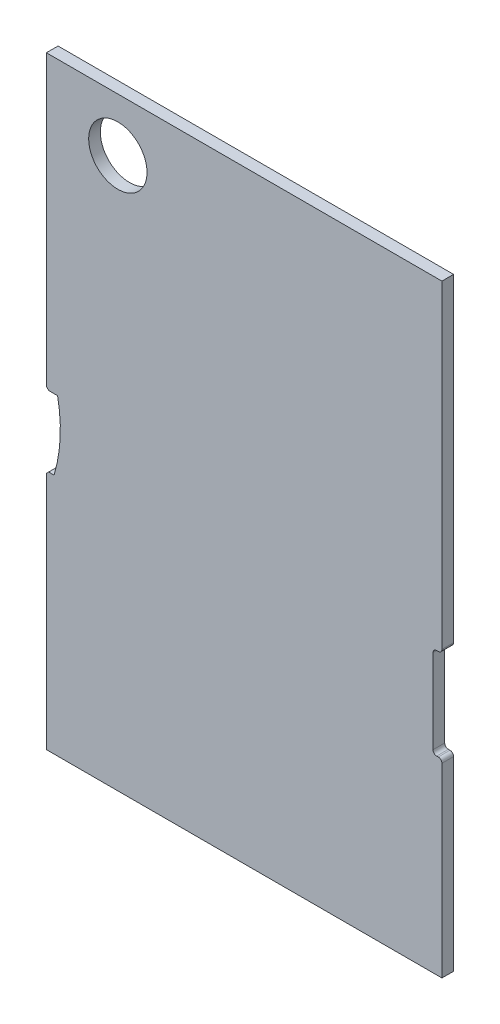
ISO-10303-21;
HEADER;
FILE_DESCRIPTION(('STEP AP214'),'2;1');
FILE_NAME('part.step','',(''),(''),'','','');
FILE_SCHEMA(('AUTOMOTIVE_DESIGN { 1 0 10303 214 1 1 1 1 }'));
ENDSEC;
DATA;
#1=APPLICATION_CONTEXT('core data for automotive mechanical design processes');
#2=APPLICATION_PROTOCOL_DEFINITION('international standard','automotive_design',2000,#1);
#3=PRODUCT_CONTEXT('',#1,'mechanical');
#4=PRODUCT('Part','Part','',(#3));
#5=PRODUCT_RELATED_PRODUCT_CATEGORY('part','',(#4));
#6=PRODUCT_DEFINITION_FORMATION('','',#4);
#7=PRODUCT_DEFINITION_CONTEXT('part definition',#1,'design');
#8=PRODUCT_DEFINITION('design','',#6,#7);
#9=PRODUCT_DEFINITION_SHAPE('','',#8);
#10=(LENGTH_UNIT() NAMED_UNIT(*) SI_UNIT(.MILLI.,.METRE.));
#11=(NAMED_UNIT(*) PLANE_ANGLE_UNIT() SI_UNIT($,.RADIAN.));
#12=(NAMED_UNIT(*) SI_UNIT($,.STERADIAN.) SOLID_ANGLE_UNIT());
#13=UNCERTAINTY_MEASURE_WITH_UNIT(LENGTH_MEASURE(1.E-05),#10,'distance_accuracy_value','');
#14=(GEOMETRIC_REPRESENTATION_CONTEXT(3) GLOBAL_UNCERTAINTY_ASSIGNED_CONTEXT((#13)) GLOBAL_UNIT_ASSIGNED_CONTEXT((#10,
#11,#12)) REPRESENTATION_CONTEXT('',''));
#15=CARTESIAN_POINT('',(0.,0.,0.));
#16=DIRECTION('',(0.,0.,1.));
#17=DIRECTION('',(1.,0.,0.));
#18=AXIS2_PLACEMENT_3D('',#15,#16,#17);
#19=CARTESIAN_POINT('',(153.69999994,125.9799995,-1.6));
#20=DIRECTION('',(0.,1.,0.));
#21=DIRECTION('',(0.,0.,1.));
#22=AXIS2_PLACEMENT_3D('',#19,#20,#21);
#23=PLANE('',#22);
#24=DIRECTION('',(1.,0.,0.));
#25=VECTOR('',#24,1.);
#26=CARTESIAN_POINT('',(153.69999994,125.9799995,-1.6));
#27=LINE('',#26,#25);
#28=CARTESIAN_POINT('',(153.69999994,125.9799995,-1.6));
#29=VERTEX_POINT('',#28);
#30=CARTESIAN_POINT('',(153.48000038,125.9799995,-1.6));
#31=VERTEX_POINT('',#30);
#32=EDGE_CURVE('E147',#29,#31,#27,.F.);
#33=ORIENTED_EDGE('',*,*,#32,.T.);
#34=DIRECTION('',(0.,0.,1.));
#35=VECTOR('',#34,1.);
#36=CARTESIAN_POINT('',(153.48000038,125.9799995,-1.6));
#37=LINE('',#36,#35);
#38=CARTESIAN_POINT('',(153.48000038,125.9799995,0.));
#39=VERTEX_POINT('',#38);
#40=EDGE_CURVE('E297',#31,#39,#37,.T.);
#41=ORIENTED_EDGE('',*,*,#40,.T.);
#42=DIRECTION('',(1.,0.,0.));
#43=VECTOR('',#42,1.);
#44=CARTESIAN_POINT('',(153.69999994,125.9799995,0.));
#45=LINE('',#44,#43);
#46=CARTESIAN_POINT('',(153.69999994,125.9799995,0.));
#47=VERTEX_POINT('',#46);
#48=EDGE_CURVE('E313',#39,#47,#45,.T.);
#49=ORIENTED_EDGE('',*,*,#48,.T.);
#50=DIRECTION('',(0.,0.,1.));
#51=VECTOR('',#50,1.);
#52=CARTESIAN_POINT('',(153.69999994,125.9799995,-1.6));
#53=LINE('',#52,#51);
#54=EDGE_CURVE('E151',#29,#47,#53,.T.);
#55=ORIENTED_EDGE('',*,*,#54,.F.);
#56=EDGE_LOOP('',(#33,#41,#49,#55));
#57=FACE_BOUND('',#56,.T.);
#58=ADVANCED_FACE('F17',(#57),#23,.T.);
#59=CARTESIAN_POINT('',(153.48000038,138.49999986,-1.6));
#60=DIRECTION('',(0.,-1.,0.));
#61=DIRECTION('',(0.,0.,-1.));
#62=AXIS2_PLACEMENT_3D('',#59,#60,#61);
#63=PLANE('',#62);
#64=DIRECTION('',(1.,0.,0.));
#65=VECTOR('',#64,1.);
#66=CARTESIAN_POINT('',(153.48000038,138.49999986,-1.6));
#67=LINE('',#66,#65);
#68=CARTESIAN_POINT('',(153.48000038,138.49999986,-1.6));
#69=VERTEX_POINT('',#68);
#70=CARTESIAN_POINT('',(153.69999994,138.49999986,-1.6));
#71=VERTEX_POINT('',#70);
#72=EDGE_CURVE('E152',#69,#71,#67,.T.);
#73=ORIENTED_EDGE('',*,*,#72,.T.);
#74=DIRECTION('',(0.,0.,1.));
#75=VECTOR('',#74,1.);
#76=CARTESIAN_POINT('',(153.69999994,138.49999986,-1.6));
#77=LINE('',#76,#75);
#78=CARTESIAN_POINT('',(153.69999994,138.49999986,0.));
#79=VERTEX_POINT('',#78);
#80=EDGE_CURVE('E290',#79,#71,#77,.F.);
#81=ORIENTED_EDGE('',*,*,#80,.F.);
#82=DIRECTION('',(1.,0.,0.));
#83=VECTOR('',#82,1.);
#84=CARTESIAN_POINT('',(153.48000038,138.49999986,0.));
#85=LINE('',#84,#83);
#86=CARTESIAN_POINT('',(153.48000038,138.49999986,0.));
#87=VERTEX_POINT('',#86);
#88=EDGE_CURVE('E310',#79,#87,#85,.F.);
#89=ORIENTED_EDGE('',*,*,#88,.T.);
#90=DIRECTION('',(0.,0.,1.));
#91=VECTOR('',#90,1.);
#92=CARTESIAN_POINT('',(153.48000038,138.49999986,-1.6));
#93=LINE('',#92,#91);
#94=EDGE_CURVE('E294',#87,#69,#93,.F.);
#95=ORIENTED_EDGE('',*,*,#94,.T.);
#96=EDGE_LOOP('',(#73,#81,#89,#95));
#97=FACE_BOUND('',#96,.T.);
#98=ADVANCED_FACE('F348',(#97),#63,.T.);
#99=CARTESIAN_POINT('',(153.69999994,125.4800005,-1.6));
#100=DIRECTION('',(0.,0.,1.));
#101=DIRECTION('',(1.,0.,0.));
#102=AXIS2_PLACEMENT_3D('',#99,#100,#101);
#103=CYLINDRICAL_SURFACE('',#102,0.499999000000001);
#104=CARTESIAN_POINT('',(153.69999994,125.4800005,-1.6));
#105=DIRECTION('',(0.,0.,1.));
#106=DIRECTION('',(1.,0.,0.));
#107=AXIS2_PLACEMENT_3D('',#104,#105,#106);
#108=CIRCLE('',#107,0.499999000000001);
#109=CARTESIAN_POINT('',(154.19999894,125.4800005,-1.6));
#110=VERTEX_POINT('',#109);
#111=EDGE_CURVE('E20',#110,#29,#108,.T.);
#112=ORIENTED_EDGE('',*,*,#111,.T.);
#113=ORIENTED_EDGE('',*,*,#54,.T.);
#114=CARTESIAN_POINT('',(153.69999994,125.4800005,0.));
#115=DIRECTION('',(0.,0.,1.));
#116=DIRECTION('',(1.,0.,0.));
#117=AXIS2_PLACEMENT_3D('',#114,#115,#116);
#118=CIRCLE('',#117,0.499999000000001);
#119=CARTESIAN_POINT('',(154.19999894,125.4800005,0.));
#120=VERTEX_POINT('',#119);
#121=EDGE_CURVE('E157',#120,#47,#118,.T.);
#122=ORIENTED_EDGE('',*,*,#121,.F.);
#123=DIRECTION('',(0.,0.,-1.));
#124=VECTOR('',#123,1.);
#125=CARTESIAN_POINT('',(154.19999894,125.4800005,-1.6));
#126=LINE('',#125,#124);
#127=EDGE_CURVE('E154',#110,#120,#126,.F.);
#128=ORIENTED_EDGE('',*,*,#127,.F.);
#129=EDGE_LOOP('',(#112,#113,#122,#128));
#130=FACE_BOUND('',#129,.T.);
#131=ADVANCED_FACE('F155',(#130),#103,.T.);
#132=CARTESIAN_POINT('',(153.48000038,126.4799985,-1.6));
#133=DIRECTION('',(0.,0.,1.));
#134=DIRECTION('',(1.,0.,0.));
#135=AXIS2_PLACEMENT_3D('',#132,#133,#134);
#136=CYLINDRICAL_SURFACE('',#135,0.499998999999973);
#137=ORIENTED_EDGE('',*,*,#40,.F.);
#138=CARTESIAN_POINT('',(153.48000038,126.4799985,-1.6));
#139=DIRECTION('',(0.,0.,1.));
#140=DIRECTION('',(1.,0.,0.));
#141=AXIS2_PLACEMENT_3D('',#138,#139,#140);
#142=CIRCLE('',#141,0.499998999999973);
#143=CARTESIAN_POINT('',(152.98000138,126.4799985,-1.6));
#144=VERTEX_POINT('',#143);
#145=EDGE_CURVE('E300',#144,#31,#142,.T.);
#146=ORIENTED_EDGE('',*,*,#145,.F.);
#147=DIRECTION('',(0.,0.,-1.));
#148=VECTOR('',#147,1.);
#149=CARTESIAN_POINT('',(152.98000138,126.4799985,-1.6));
#150=LINE('',#149,#148);
#151=CARTESIAN_POINT('',(152.98000138,126.4799985,0.));
#152=VERTEX_POINT('',#151);
#153=EDGE_CURVE('E200',#152,#144,#150,.T.);
#154=ORIENTED_EDGE('',*,*,#153,.F.);
#155=CARTESIAN_POINT('',(153.48000038,126.4799985,0.));
#156=DIRECTION('',(0.,0.,1.));
#157=DIRECTION('',(1.,0.,0.));
#158=AXIS2_PLACEMENT_3D('',#155,#156,#157);
#159=CIRCLE('',#158,0.499998999999973);
#160=EDGE_CURVE('E330',#39,#152,#159,.F.);
#161=ORIENTED_EDGE('',*,*,#160,.F.);
#162=EDGE_LOOP('',(#137,#146,#154,#161));
#163=FACE_BOUND('',#162,.T.);
#164=ADVANCED_FACE('F338',(#163),#136,.F.);
#165=CARTESIAN_POINT('',(153.48000038,138.00000086,-1.6));
#166=DIRECTION('',(0.,0.,1.));
#167=DIRECTION('',(1.,0.,0.));
#168=AXIS2_PLACEMENT_3D('',#165,#166,#167);
#169=CYLINDRICAL_SURFACE('',#168,0.499998999999973);
#170=DIRECTION('',(0.,0.,-1.));
#171=VECTOR('',#170,1.);
#172=CARTESIAN_POINT('',(152.98000138,138.00000086,-1.6));
#173=LINE('',#172,#171);
#174=CARTESIAN_POINT('',(152.98000138,138.00000086,-1.6));
#175=VERTEX_POINT('',#174);
#176=CARTESIAN_POINT('',(152.98000138,138.00000086,0.));
#177=VERTEX_POINT('',#176);
#178=EDGE_CURVE('E203',#175,#177,#173,.F.);
#179=ORIENTED_EDGE('',*,*,#178,.F.);
#180=CARTESIAN_POINT('',(153.48000038,138.00000086,-1.6));
#181=DIRECTION('',(0.,0.,1.));
#182=DIRECTION('',(1.,0.,0.));
#183=AXIS2_PLACEMENT_3D('',#180,#181,#182);
#184=CIRCLE('',#183,0.499998999999973);
#185=EDGE_CURVE('E293',#69,#175,#184,.T.);
#186=ORIENTED_EDGE('',*,*,#185,.F.);
#187=ORIENTED_EDGE('',*,*,#94,.F.);
#188=CARTESIAN_POINT('',(153.48000038,138.00000086,0.));
#189=DIRECTION('',(0.,0.,1.));
#190=DIRECTION('',(1.,0.,0.));
#191=AXIS2_PLACEMENT_3D('',#188,#189,#190);
#192=CIRCLE('',#191,0.499998999999973);
#193=EDGE_CURVE('E327',#177,#87,#192,.F.);
#194=ORIENTED_EDGE('',*,*,#193,.F.);
#195=EDGE_LOOP('',(#179,#186,#187,#194));
#196=FACE_BOUND('',#195,.T.);
#197=ADVANCED_FACE('F414',(#196),#169,.F.);
#198=CARTESIAN_POINT('',(153.69999994,138.99999886,-1.6));
#199=DIRECTION('',(0.,0.,1.));
#200=DIRECTION('',(1.,0.,0.));
#201=AXIS2_PLACEMENT_3D('',#198,#199,#200);
#202=CYLINDRICAL_SURFACE('',#201,0.499999000000001);
#203=CARTESIAN_POINT('',(153.69999994,138.99999886,-1.6));
#204=DIRECTION('',(0.,0.,1.));
#205=DIRECTION('',(1.,0.,0.));
#206=AXIS2_PLACEMENT_3D('',#203,#204,#205);
#207=CIRCLE('',#206,0.499999000000001);
#208=CARTESIAN_POINT('',(154.19999894,138.99999886,-1.6));
#209=VERTEX_POINT('',#208);
#210=EDGE_CURVE('E257',#71,#209,#207,.T.);
#211=ORIENTED_EDGE('',*,*,#210,.T.);
#212=DIRECTION('',(0.,0.,-1.));
#213=VECTOR('',#212,1.);
#214=CARTESIAN_POINT('',(154.19999894,138.99999886,-1.6));
#215=LINE('',#214,#213);
#216=CARTESIAN_POINT('',(154.19999894,138.99999886,0.));
#217=VERTEX_POINT('',#216);
#218=EDGE_CURVE('E184',#217,#209,#215,.T.);
#219=ORIENTED_EDGE('',*,*,#218,.F.);
#220=CARTESIAN_POINT('',(153.69999994,138.99999886,0.));
#221=DIRECTION('',(0.,0.,1.));
#222=DIRECTION('',(1.,0.,0.));
#223=AXIS2_PLACEMENT_3D('',#220,#221,#222);
#224=CIRCLE('',#223,0.499999000000001);
#225=EDGE_CURVE('E261',#79,#217,#224,.T.);
#226=ORIENTED_EDGE('',*,*,#225,.F.);
#227=ORIENTED_EDGE('',*,*,#80,.T.);
#228=EDGE_LOOP('',(#211,#219,#226,#227));
#229=FACE_BOUND('',#228,.T.);
#230=ADVANCED_FACE('F410',(#229),#202,.T.);
#231=CARTESIAN_POINT('',(100.00000066,143.09000084,-1.6));
#232=DIRECTION('',(-0.707106781186548,-0.707106781186548,0.));
#233=DIRECTION('',(0.707106781186548,-0.707106781186548,0.));
#234=AXIS2_PLACEMENT_3D('',#231,#232,#233);
#235=PLANE('',#234);
#236=DIRECTION('',(0.707106781186548,-0.707106781186548,0.));
#237=VECTOR('',#236,1.);
#238=CARTESIAN_POINT('',(100.00000066,143.09000084,-1.6));
#239=LINE('',#238,#237);
#240=CARTESIAN_POINT('',(100.00000066,143.09000084,-1.6));
#241=VERTEX_POINT('',#240);
#242=CARTESIAN_POINT('',(100.32108714,142.76891436,-1.6));
#243=VERTEX_POINT('',#242);
#244=EDGE_CURVE('E248',#241,#243,#239,.T.);
#245=ORIENTED_EDGE('',*,*,#244,.T.);
#246=DIRECTION('',(0.,0.,-1.));
#247=VECTOR('',#246,1.);
#248=CARTESIAN_POINT('',(100.32108714,142.76891436,-1.6));
#249=LINE('',#248,#247);
#250=CARTESIAN_POINT('',(100.32108714,142.76891436,0.));
#251=VERTEX_POINT('',#250);
#252=EDGE_CURVE('E177',#251,#243,#249,.T.);
#253=ORIENTED_EDGE('',*,*,#252,.F.);
#254=DIRECTION('',(0.707106781186532,-0.707106781186563,0.));
#255=VECTOR('',#254,1.);
#256=CARTESIAN_POINT('',(100.00000066,143.09000084,0.));
#257=LINE('',#256,#255);
#258=CARTESIAN_POINT('',(100.00000066,143.09000084,0.));
#259=VERTEX_POINT('',#258);
#260=EDGE_CURVE('E226',#259,#251,#257,.T.);
#261=ORIENTED_EDGE('',*,*,#260,.F.);
#262=DIRECTION('',(0.,0.,1.));
#263=VECTOR('',#262,1.);
#264=CARTESIAN_POINT('',(100.00000066,143.09000084,-1.6));
#265=LINE('',#264,#263);
#266=EDGE_CURVE('E253',#241,#259,#265,.T.);
#267=ORIENTED_EDGE('',*,*,#266,.F.);
#268=EDGE_LOOP('',(#245,#253,#261,#267));
#269=FACE_BOUND('',#268,.T.);
#270=ADVANCED_FACE('F406',(#269),#235,.T.);
#271=CARTESIAN_POINT('',(101.04820024,133.1000005,-1.6));
#272=DIRECTION('',(0.,1.,0.));
#273=DIRECTION('',(0.,0.,1.));
#274=AXIS2_PLACEMENT_3D('',#271,#272,#273);
#275=PLANE('',#274);
#276=DIRECTION('',(1.,0.,0.));
#277=VECTOR('',#276,1.);
#278=CARTESIAN_POINT('',(101.04820024,133.1000005,-1.6));
#279=LINE('',#278,#277);
#280=CARTESIAN_POINT('',(101.048201527625,133.1000005,-1.6));
#281=VERTEX_POINT('',#280);
#282=CARTESIAN_POINT('',(100.31000004,133.1000005,-1.6));
#283=VERTEX_POINT('',#282);
#284=EDGE_CURVE('E245',#281,#283,#279,.F.);
#285=ORIENTED_EDGE('',*,*,#284,.T.);
#286=DIRECTION('',(0.,0.,1.));
#287=VECTOR('',#286,1.);
#288=CARTESIAN_POINT('',(100.31000004,133.1000005,-1.6));
#289=LINE('',#288,#287);
#290=CARTESIAN_POINT('',(100.31000004,133.1000005,0.));
#291=VERTEX_POINT('',#290);
#292=EDGE_CURVE('E247',#291,#283,#289,.F.);
#293=ORIENTED_EDGE('',*,*,#292,.F.);
#294=DIRECTION('',(1.,0.,0.));
#295=VECTOR('',#294,1.);
#296=CARTESIAN_POINT('',(153.69999994,133.1000005,0.));
#297=LINE('',#296,#295);
#298=CARTESIAN_POINT('',(101.048201527625,133.1000005,0.));
#299=VERTEX_POINT('',#298);
#300=EDGE_CURVE('E223',#299,#291,#297,.F.);
#301=ORIENTED_EDGE('',*,*,#300,.F.);
#302=DIRECTION('',(0.,0.,1.));
#303=VECTOR('',#302,1.);
#304=CARTESIAN_POINT('',(101.048201527625,133.1000005,0.));
#305=LINE('',#304,#303);
#306=EDGE_CURVE('E236',#299,#281,#305,.F.);
#307=ORIENTED_EDGE('',*,*,#306,.T.);
#308=EDGE_LOOP('',(#285,#293,#301,#307));
#309=FACE_BOUND('',#308,.T.);
#310=ADVANCED_FACE('F403',(#309),#275,.T.);
#311=CARTESIAN_POINT('',(100.31000004,133.1000005,-1.6));
#312=DIRECTION('',(-0.707106781186516,0.707106781186579,0.));
#313=DIRECTION('',(-0.707106781186579,-0.707106781186516,0.));
#314=AXIS2_PLACEMENT_3D('',#311,#312,#313);
#315=PLANE('',#314);
#316=DIRECTION('',(-0.707106781186579,-0.707106781186516,0.));
#317=VECTOR('',#316,1.);
#318=CARTESIAN_POINT('',(100.31000004,133.1000005,-1.6));
#319=LINE('',#318,#317);
#320=CARTESIAN_POINT('',(100.00000066,132.79000112,-1.6));
#321=VERTEX_POINT('',#320);
#322=EDGE_CURVE('E35',#283,#321,#319,.T.);
#323=ORIENTED_EDGE('',*,*,#322,.T.);
#324=DIRECTION('',(0.,0.,1.));
#325=VECTOR('',#324,1.);
#326=CARTESIAN_POINT('',(100.00000066,132.79000112,-1.6));
#327=LINE('',#326,#325);
#328=CARTESIAN_POINT('',(100.00000066,132.79000112,0.));
#329=VERTEX_POINT('',#328);
#330=EDGE_CURVE('E215',#329,#321,#327,.F.);
#331=ORIENTED_EDGE('',*,*,#330,.F.);
#332=DIRECTION('',(-0.707106781186579,-0.707106781186516,0.));
#333=VECTOR('',#332,1.);
#334=CARTESIAN_POINT('',(100.31000004,133.1000005,0.));
#335=LINE('',#334,#333);
#336=EDGE_CURVE('E225',#291,#329,#335,.T.);
#337=ORIENTED_EDGE('',*,*,#336,.F.);
#338=ORIENTED_EDGE('',*,*,#292,.T.);
#339=EDGE_LOOP('',(#323,#331,#337,#338));
#340=FACE_BOUND('',#339,.T.);
#341=ADVANCED_FACE('F399',(#340),#315,.T.);
#342=CARTESIAN_POINT('',(153.69999994,125.4800005,0.));
#343=DIRECTION('',(0.,0.,1.));
#344=DIRECTION('',(1.,0.,0.));
#345=AXIS2_PLACEMENT_3D('',#342,#343,#344);
#346=PLANE('',#345);
#347=CARTESIAN_POINT('',(109.78999886,175.38999974,0.));
#348=DIRECTION('',(0.,0.,-1.));
#349=DIRECTION('',(-1.,0.,0.));
#350=AXIS2_PLACEMENT_3D('',#347,#348,#349);
#351=CIRCLE('',#350,3.99999962);
#352=CARTESIAN_POINT('',(105.78999924,175.38999974,0.));
#353=VERTEX_POINT('',#352);
#354=EDGE_CURVE('E171',#353,#353,#351,.T.);
#355=ORIENTED_EDGE('',*,*,#354,.T.);
#356=EDGE_LOOP('',(#355));
#357=FACE_BOUND('',#356,.T.);
#358=ORIENTED_EDGE('',*,*,#300,.T.);
#359=ORIENTED_EDGE('',*,*,#336,.T.);
#360=DIRECTION('',(0.,1.,0.));
#361=VECTOR('',#360,1.);
#362=CARTESIAN_POINT('',(100.00000066,132.79000112,0.));
#363=LINE('',#362,#361);
#364=CARTESIAN_POINT('',(100.00000066,100.00000066,0.));
#365=VERTEX_POINT('',#364);
#366=EDGE_CURVE('E233',#365,#329,#363,.T.);
#367=ORIENTED_EDGE('',*,*,#366,.F.);
#368=DIRECTION('',(1.,0.,0.));
#369=VECTOR('',#368,1.);
#370=CARTESIAN_POINT('',(100.00000066,100.00000066,0.));
#371=LINE('',#370,#369);
#372=CARTESIAN_POINT('',(154.19999894,100.00000066,0.));
#373=VERTEX_POINT('',#372);
#374=EDGE_CURVE('E229',#373,#365,#371,.F.);
#375=ORIENTED_EDGE('',*,*,#374,.F.);
#376=DIRECTION('',(0.,1.,0.));
#377=VECTOR('',#376,1.);
#378=CARTESIAN_POINT('',(154.19999894,100.00000066,0.));
#379=LINE('',#378,#377);
#380=EDGE_CURVE('E207',#120,#373,#379,.F.);
#381=ORIENTED_EDGE('',*,*,#380,.F.);
#382=ORIENTED_EDGE('',*,*,#121,.T.);
#383=ORIENTED_EDGE('',*,*,#48,.F.);
#384=ORIENTED_EDGE('',*,*,#160,.T.);
#385=DIRECTION('',(0.,1.,0.));
#386=VECTOR('',#385,1.);
#387=CARTESIAN_POINT('',(152.98000138,126.4799985,0.));
#388=LINE('',#387,#386);
#389=EDGE_CURVE('E160',#177,#152,#388,.F.);
#390=ORIENTED_EDGE('',*,*,#389,.F.);
#391=ORIENTED_EDGE('',*,*,#193,.T.);
#392=ORIENTED_EDGE('',*,*,#88,.F.);
#393=ORIENTED_EDGE('',*,*,#225,.T.);
#394=DIRECTION('',(0.,1.,0.));
#395=VECTOR('',#394,1.);
#396=CARTESIAN_POINT('',(154.19999894,138.99999886,0.));
#397=LINE('',#396,#395);
#398=CARTESIAN_POINT('',(154.19999894,182.70000036,0.));
#399=VERTEX_POINT('',#398);
#400=EDGE_CURVE('E188',#399,#217,#397,.F.);
#401=ORIENTED_EDGE('',*,*,#400,.F.);
#402=DIRECTION('',(1.,0.,0.));
#403=VECTOR('',#402,1.);
#404=CARTESIAN_POINT('',(154.19999894,182.70000036,0.));
#405=LINE('',#404,#403);
#406=CARTESIAN_POINT('',(100.00000066,182.70000036,0.));
#407=VERTEX_POINT('',#406);
#408=EDGE_CURVE('E187',#407,#399,#405,.T.);
#409=ORIENTED_EDGE('',*,*,#408,.F.);
#410=DIRECTION('',(0.,1.,0.));
#411=VECTOR('',#410,1.);
#412=CARTESIAN_POINT('',(100.00000066,182.70000036,0.));
#413=LINE('',#412,#411);
#414=EDGE_CURVE('E197',#259,#407,#413,.T.);
#415=ORIENTED_EDGE('',*,*,#414,.F.);
#416=ORIENTED_EDGE('',*,*,#260,.T.);
#417=DIRECTION('',(1.,0.,0.));
#418=VECTOR('',#417,1.);
#419=CARTESIAN_POINT('',(100.32108714,142.76891436,0.));
#420=LINE('',#419,#418);
#421=CARTESIAN_POINT('',(101.534055277497,142.76891436,0.));
#422=VERTEX_POINT('',#421);
#423=EDGE_CURVE('E181',#422,#251,#420,.F.);
#424=ORIENTED_EDGE('',*,*,#423,.F.);
#425=CARTESIAN_POINT('',(81.96409312,138.90562262,0.));
#426=DIRECTION('',(0.,0.,1.));
#427=DIRECTION('',(1.,0.,0.));
#428=AXIS2_PLACEMENT_3D('',#425,#426,#427);
#429=CIRCLE('',#428,19.9476425152004);
#430=EDGE_CURVE('E321',#422,#299,#429,.F.);
#431=ORIENTED_EDGE('',*,*,#430,.T.);
#432=EDGE_LOOP('',(#358,#359,#367,#375,#381,#382,#383,#384,#390,#391,#392,#393,#401,#409,#415,
#416,#424,#431));
#433=FACE_BOUND('',#432,.T.);
#434=ADVANCED_FACE('F345',(#357,#433),#346,.T.);
#435=CARTESIAN_POINT('',(100.00000066,100.00000066,-1.6));
#436=DIRECTION('',(0.,-1.,0.));
#437=DIRECTION('',(0.,0.,-1.));
#438=AXIS2_PLACEMENT_3D('',#435,#436,#437);
#439=PLANE('',#438);
#440=DIRECTION('',(1.,0.,0.));
#441=VECTOR('',#440,1.);
#442=CARTESIAN_POINT('',(153.69999994,100.00000066,-1.6));
#443=LINE('',#442,#441);
#444=CARTESIAN_POINT('',(100.00000066,100.00000066,-1.6));
#445=VERTEX_POINT('',#444);
#446=CARTESIAN_POINT('',(154.19999894,100.00000066,-1.6));
#447=VERTEX_POINT('',#446);
#448=EDGE_CURVE('E166',#445,#447,#443,.T.);
#449=ORIENTED_EDGE('',*,*,#448,.T.);
#450=DIRECTION('',(0.,0.,-1.));
#451=VECTOR('',#450,1.);
#452=CARTESIAN_POINT('',(154.19999894,100.00000066,-1.6));
#453=LINE('',#452,#451);
#454=EDGE_CURVE('E161',#373,#447,#453,.T.);
#455=ORIENTED_EDGE('',*,*,#454,.F.);
#456=ORIENTED_EDGE('',*,*,#374,.T.);
#457=DIRECTION('',(0.,0.,1.));
#458=VECTOR('',#457,1.);
#459=CARTESIAN_POINT('',(100.00000066,100.00000066,-1.6));
#460=LINE('',#459,#458);
#461=EDGE_CURVE('E212',#445,#365,#460,.T.);
#462=ORIENTED_EDGE('',*,*,#461,.F.);
#463=EDGE_LOOP('',(#449,#455,#456,#462));
#464=FACE_BOUND('',#463,.T.);
#465=ADVANCED_FACE('F393',(#464),#439,.T.);
#466=CARTESIAN_POINT('',(154.19999894,100.00000066,-1.6));
#467=DIRECTION('',(1.,0.,0.));
#468=DIRECTION('',(0.,0.,-1.));
#469=AXIS2_PLACEMENT_3D('',#466,#467,#468);
#470=PLANE('',#469);
#471=DIRECTION('',(0.,1.,0.));
#472=VECTOR('',#471,1.);
#473=CARTESIAN_POINT('',(154.19999894,125.4800005,-1.6));
#474=LINE('',#473,#472);
#475=EDGE_CURVE('E144',#447,#110,#474,.T.);
#476=ORIENTED_EDGE('',*,*,#475,.T.);
#477=ORIENTED_EDGE('',*,*,#127,.T.);
#478=ORIENTED_EDGE('',*,*,#380,.T.);
#479=ORIENTED_EDGE('',*,*,#454,.T.);
#480=EDGE_LOOP('',(#476,#477,#478,#479));
#481=FACE_BOUND('',#480,.T.);
#482=ADVANCED_FACE('F163',(#481),#470,.T.);
#483=CARTESIAN_POINT('',(152.98000138,126.4799985,-1.6));
#484=DIRECTION('',(1.,0.,0.));
#485=DIRECTION('',(0.,0.,-1.));
#486=AXIS2_PLACEMENT_3D('',#483,#484,#485);
#487=PLANE('',#486);
#488=DIRECTION('',(0.,1.,0.));
#489=VECTOR('',#488,1.);
#490=CARTESIAN_POINT('',(152.98000138,125.4800005,-1.6));
#491=LINE('',#490,#489);
#492=EDGE_CURVE('E165',#144,#175,#491,.T.);
#493=ORIENTED_EDGE('',*,*,#492,.T.);
#494=ORIENTED_EDGE('',*,*,#178,.T.);
#495=ORIENTED_EDGE('',*,*,#389,.T.);
#496=ORIENTED_EDGE('',*,*,#153,.T.);
#497=EDGE_LOOP('',(#493,#494,#495,#496));
#498=FACE_BOUND('',#497,.T.);
#499=ADVANCED_FACE('F341',(#498),#487,.T.);
#500=CARTESIAN_POINT('',(154.19999894,138.99999886,-1.6));
#501=DIRECTION('',(1.,0.,0.));
#502=DIRECTION('',(0.,0.,-1.));
#503=AXIS2_PLACEMENT_3D('',#500,#501,#502);
#504=PLANE('',#503);
#505=DIRECTION('',(0.,1.,0.));
#506=VECTOR('',#505,1.);
#507=CARTESIAN_POINT('',(154.19999894,125.4800005,-1.6));
#508=LINE('',#507,#506);
#509=CARTESIAN_POINT('',(154.19999894,182.70000036,-1.6));
#510=VERTEX_POINT('',#509);
#511=EDGE_CURVE('E169',#209,#510,#508,.T.);
#512=ORIENTED_EDGE('',*,*,#511,.T.);
#513=DIRECTION('',(0.,0.,1.));
#514=VECTOR('',#513,1.);
#515=CARTESIAN_POINT('',(154.19999894,182.70000036,-1.6));
#516=LINE('',#515,#514);
#517=EDGE_CURVE('E195',#399,#510,#516,.F.);
#518=ORIENTED_EDGE('',*,*,#517,.F.);
#519=ORIENTED_EDGE('',*,*,#400,.T.);
#520=ORIENTED_EDGE('',*,*,#218,.T.);
#521=EDGE_LOOP('',(#512,#518,#519,#520));
#522=FACE_BOUND('',#521,.T.);
#523=ADVANCED_FACE('F384',(#522),#504,.T.);
#524=CARTESIAN_POINT('',(154.19999894,182.70000036,-1.6));
#525=DIRECTION('',(0.,1.,0.));
#526=DIRECTION('',(0.,0.,1.));
#527=AXIS2_PLACEMENT_3D('',#524,#525,#526);
#528=PLANE('',#527);
#529=DIRECTION('',(1.,0.,0.));
#530=VECTOR('',#529,1.);
#531=CARTESIAN_POINT('',(153.69999994,182.70000036,-1.6));
#532=LINE('',#531,#530);
#533=CARTESIAN_POINT('',(100.00000066,182.70000036,-1.6));
#534=VERTEX_POINT('',#533);
#535=EDGE_CURVE('E189',#510,#534,#532,.F.);
#536=ORIENTED_EDGE('',*,*,#535,.T.);
#537=DIRECTION('',(0.,0.,1.));
#538=VECTOR('',#537,1.);
#539=CARTESIAN_POINT('',(100.00000066,182.70000036,-1.6));
#540=LINE('',#539,#538);
#541=EDGE_CURVE('E272',#407,#534,#540,.F.);
#542=ORIENTED_EDGE('',*,*,#541,.F.);
#543=ORIENTED_EDGE('',*,*,#408,.T.);
#544=ORIENTED_EDGE('',*,*,#517,.T.);
#545=EDGE_LOOP('',(#536,#542,#543,#544));
#546=FACE_BOUND('',#545,.T.);
#547=ADVANCED_FACE('F380',(#546),#528,.T.);
#548=CARTESIAN_POINT('',(100.00000066,182.70000036,-1.6));
#549=DIRECTION('',(-1.,0.,0.));
#550=DIRECTION('',(0.,0.,1.));
#551=AXIS2_PLACEMENT_3D('',#548,#549,#550);
#552=PLANE('',#551);
#553=DIRECTION('',(0.,1.,0.));
#554=VECTOR('',#553,1.);
#555=CARTESIAN_POINT('',(100.00000066,125.4800005,-1.6));
#556=LINE('',#555,#554);
#557=EDGE_CURVE('E192',#534,#241,#556,.F.);
#558=ORIENTED_EDGE('',*,*,#557,.T.);
#559=ORIENTED_EDGE('',*,*,#266,.T.);
#560=ORIENTED_EDGE('',*,*,#414,.T.);
#561=ORIENTED_EDGE('',*,*,#541,.T.);
#562=EDGE_LOOP('',(#558,#559,#560,#561));
#563=FACE_BOUND('',#562,.T.);
#564=ADVANCED_FACE('F376',(#563),#552,.T.);
#565=CARTESIAN_POINT('',(100.32108714,142.76891436,-1.6));
#566=DIRECTION('',(0.,-1.,0.));
#567=DIRECTION('',(0.,0.,-1.));
#568=AXIS2_PLACEMENT_3D('',#565,#566,#567);
#569=PLANE('',#568);
#570=DIRECTION('',(1.,0.,0.));
#571=VECTOR('',#570,1.);
#572=CARTESIAN_POINT('',(153.69999994,142.76891436,-1.6));
#573=LINE('',#572,#571);
#574=CARTESIAN_POINT('',(101.534055277497,142.76891436,-1.6));
#575=VERTEX_POINT('',#574);
#576=EDGE_CURVE('E307',#243,#575,#573,.T.);
#577=ORIENTED_EDGE('',*,*,#576,.T.);
#578=DIRECTION('',(0.,0.,1.));
#579=VECTOR('',#578,1.);
#580=CARTESIAN_POINT('',(101.534055277497,142.76891436,-1.6));
#581=LINE('',#580,#579);
#582=EDGE_CURVE('E180',#575,#422,#581,.T.);
#583=ORIENTED_EDGE('',*,*,#582,.T.);
#584=ORIENTED_EDGE('',*,*,#423,.T.);
#585=ORIENTED_EDGE('',*,*,#252,.T.);
#586=EDGE_LOOP('',(#577,#583,#584,#585));
#587=FACE_BOUND('',#586,.T.);
#588=ADVANCED_FACE('F372',(#587),#569,.T.);
#589=CARTESIAN_POINT('',(81.96409312,138.90562262,-1.6));
#590=DIRECTION('',(0.,0.,1.));
#591=DIRECTION('',(1.,0.,0.));
#592=AXIS2_PLACEMENT_3D('',#589,#590,#591);
#593=CYLINDRICAL_SURFACE('',#592,19.9476425152004);
#594=CARTESIAN_POINT('',(81.96409312,138.90562262,-1.6));
#595=DIRECTION('',(0.,0.,1.));
#596=DIRECTION('',(1.,0.,0.));
#597=AXIS2_PLACEMENT_3D('',#594,#595,#596);
#598=CIRCLE('',#597,19.9476425152004);
#599=EDGE_CURVE('E220',#575,#281,#598,.F.);
#600=ORIENTED_EDGE('',*,*,#599,.T.);
#601=ORIENTED_EDGE('',*,*,#306,.F.);
#602=ORIENTED_EDGE('',*,*,#430,.F.);
#603=ORIENTED_EDGE('',*,*,#582,.F.);
#604=EDGE_LOOP('',(#600,#601,#602,#603));
#605=FACE_BOUND('',#604,.T.);
#606=ADVANCED_FACE('F368',(#605),#593,.F.);
#607=CARTESIAN_POINT('',(100.00000066,132.79000112,-1.6));
#608=DIRECTION('',(-1.,0.,0.));
#609=DIRECTION('',(0.,0.,1.));
#610=AXIS2_PLACEMENT_3D('',#607,#608,#609);
#611=PLANE('',#610);
#612=DIRECTION('',(0.,1.,0.));
#613=VECTOR('',#612,1.);
#614=CARTESIAN_POINT('',(100.00000066,125.4800005,-1.6));
#615=LINE('',#614,#613);
#616=EDGE_CURVE('E26',#321,#445,#615,.F.);
#617=ORIENTED_EDGE('',*,*,#616,.T.);
#618=ORIENTED_EDGE('',*,*,#461,.T.);
#619=ORIENTED_EDGE('',*,*,#366,.T.);
#620=ORIENTED_EDGE('',*,*,#330,.T.);
#621=EDGE_LOOP('',(#617,#618,#619,#620));
#622=FACE_BOUND('',#621,.T.);
#623=ADVANCED_FACE('F361',(#622),#611,.T.);
#624=CARTESIAN_POINT('',(109.78999886,175.38999974,0.04826));
#625=DIRECTION('',(0.,0.,-1.));
#626=DIRECTION('',(-1.,0.,0.));
#627=AXIS2_PLACEMENT_3D('',#624,#625,#626);
#628=CYLINDRICAL_SURFACE('',#627,3.99999962);
#629=CARTESIAN_POINT('',(109.78999886,175.38999974,-1.6));
#630=DIRECTION('',(0.,0.,-1.));
#631=DIRECTION('',(-1.,0.,0.));
#632=AXIS2_PLACEMENT_3D('',#629,#630,#631);
#633=CIRCLE('',#632,3.99999962);
#634=CARTESIAN_POINT('',(105.78999924,175.38999974,-1.6));
#635=VERTEX_POINT('',#634);
#636=EDGE_CURVE('E11',#635,#635,#633,.T.);
#637=ORIENTED_EDGE('',*,*,#636,.T.);
#638=EDGE_LOOP('',(#637));
#639=FACE_BOUND('',#638,.T.);
#640=ORIENTED_EDGE('',*,*,#354,.F.);
#641=EDGE_LOOP('',(#640));
#642=FACE_BOUND('',#641,.T.);
#643=ADVANCED_FACE('F355',(#639,#642),#628,.F.);
#644=CARTESIAN_POINT('',(153.69999994,125.4800005,-1.6));
#645=DIRECTION('',(0.,0.,1.));
#646=DIRECTION('',(1.,0.,0.));
#647=AXIS2_PLACEMENT_3D('',#644,#645,#646);
#648=PLANE('',#647);
#649=ORIENTED_EDGE('',*,*,#636,.F.);
#650=EDGE_LOOP('',(#649));
#651=FACE_BOUND('',#650,.T.);
#652=ORIENTED_EDGE('',*,*,#322,.F.);
#653=ORIENTED_EDGE('',*,*,#284,.F.);
#654=ORIENTED_EDGE('',*,*,#599,.F.);
#655=ORIENTED_EDGE('',*,*,#576,.F.);
#656=ORIENTED_EDGE('',*,*,#244,.F.);
#657=ORIENTED_EDGE('',*,*,#557,.F.);
#658=ORIENTED_EDGE('',*,*,#535,.F.);
#659=ORIENTED_EDGE('',*,*,#511,.F.);
#660=ORIENTED_EDGE('',*,*,#210,.F.);
#661=ORIENTED_EDGE('',*,*,#72,.F.);
#662=ORIENTED_EDGE('',*,*,#185,.T.);
#663=ORIENTED_EDGE('',*,*,#492,.F.);
#664=ORIENTED_EDGE('',*,*,#145,.T.);
#665=ORIENTED_EDGE('',*,*,#32,.F.);
#666=ORIENTED_EDGE('',*,*,#111,.F.);
#667=ORIENTED_EDGE('',*,*,#475,.F.);
#668=ORIENTED_EDGE('',*,*,#448,.F.);
#669=ORIENTED_EDGE('',*,*,#616,.F.);
#670=EDGE_LOOP('',(#652,#653,#654,#655,#656,#657,#658,#659,#660,#661,#662,#663,#664,#665,#666,
#667,#668,#669));
#671=FACE_BOUND('',#670,.T.);
#672=ADVANCED_FACE('F142',(#651,#671),#648,.F.);
#673=CLOSED_SHELL('',(#58,#98,#131,#164,#197,#230,#270,#310,#341,#434,#465,#482,#499,#523,#547,
#564,#588,#606,#623,#643,#672));
#674=MANIFOLD_SOLID_BREP('B1',#673);
#675=ADVANCED_BREP_SHAPE_REPRESENTATION('',(#18,#674),#14);
#676=SHAPE_DEFINITION_REPRESENTATION(#9,#675);
ENDSEC;
END-ISO-10303-21;
